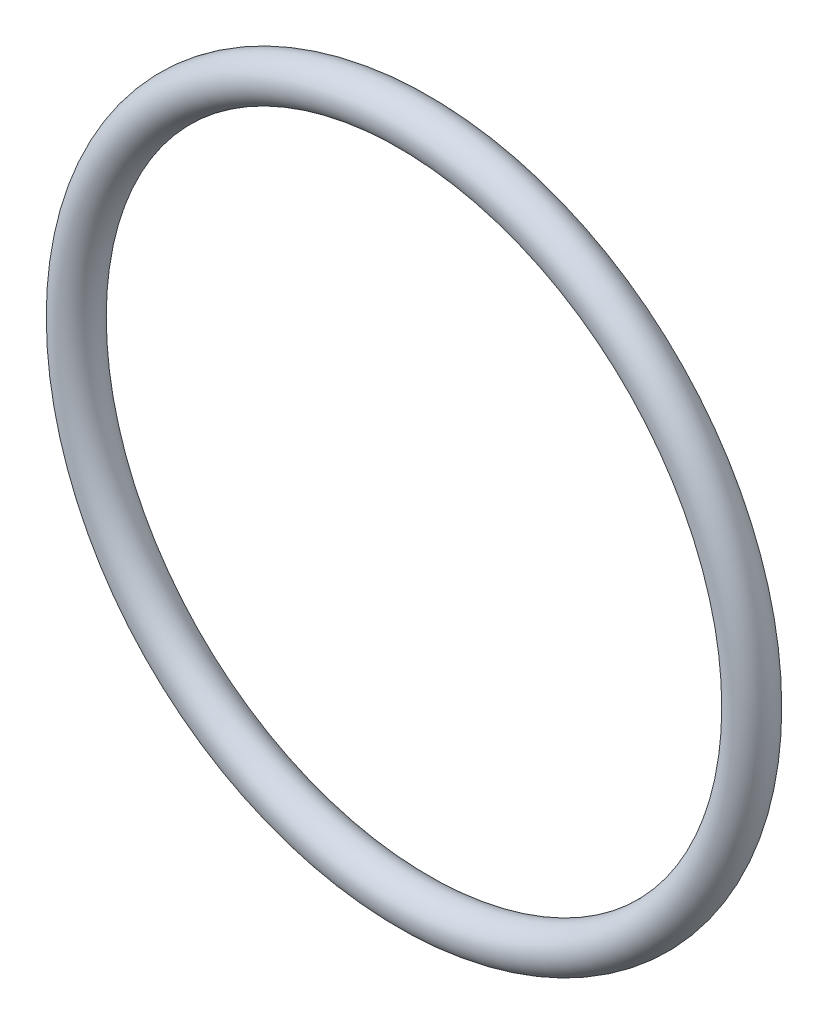
ISO-10303-21;
HEADER;
FILE_DESCRIPTION(('STEP AP214'),'2;1');
FILE_NAME('part.step','',(''),(''),'','','');
FILE_SCHEMA(('AUTOMOTIVE_DESIGN { 1 0 10303 214 1 1 1 1 }'));
ENDSEC;
DATA;
#1=APPLICATION_CONTEXT('core data for automotive mechanical design processes');
#2=APPLICATION_PROTOCOL_DEFINITION('international standard','automotive_design',2000,#1);
#3=PRODUCT_CONTEXT('',#1,'mechanical');
#4=PRODUCT('Part','Part','',(#3));
#5=PRODUCT_RELATED_PRODUCT_CATEGORY('part','',(#4));
#6=PRODUCT_DEFINITION_FORMATION('','',#4);
#7=PRODUCT_DEFINITION_CONTEXT('part definition',#1,'design');
#8=PRODUCT_DEFINITION('design','',#6,#7);
#9=PRODUCT_DEFINITION_SHAPE('','',#8);
#10=(LENGTH_UNIT() NAMED_UNIT(*) SI_UNIT(.MILLI.,.METRE.));
#11=(NAMED_UNIT(*) PLANE_ANGLE_UNIT() SI_UNIT($,.RADIAN.));
#12=(NAMED_UNIT(*) SI_UNIT($,.STERADIAN.) SOLID_ANGLE_UNIT());
#13=UNCERTAINTY_MEASURE_WITH_UNIT(LENGTH_MEASURE(1.E-05),#10,'distance_accuracy_value','');
#14=(GEOMETRIC_REPRESENTATION_CONTEXT(3) GLOBAL_UNCERTAINTY_ASSIGNED_CONTEXT((#13)) GLOBAL_UNIT_ASSIGNED_CONTEXT((#10,
#11,#12)) REPRESENTATION_CONTEXT('',''));
#15=CARTESIAN_POINT('',(0.,0.,0.));
#16=DIRECTION('',(0.,0.,1.));
#17=DIRECTION('',(1.,0.,0.));
#18=AXIS2_PLACEMENT_3D('',#15,#16,#17);
#19=CARTESIAN_POINT('',(14.0282860032337,0.,0.));
#20=DIRECTION('',(0.,0.,1.));
#21=DIRECTION('',(1.,0.,0.));
#22=AXIS2_PLACEMENT_3D('',#19,#20,#21);
#23=TOROIDAL_SURFACE('',#22,31.83098862,2.);
#24=CARTESIAN_POINT('',(-17.8027026167663,0.,0.));
#25=DIRECTION('',(0.,1.,0.));
#26=DIRECTION('',(0.,0.,1.));
#27=AXIS2_PLACEMENT_3D('',#24,#25,#26);
#28=CIRCLE('',#27,2.);
#29=CARTESIAN_POINT('',(-19.8027026167663,0.,0.));
#30=VERTEX_POINT('',#29);
#31=EDGE_CURVE('E10',#30,#30,#28,.T.);
#32=CARTESIAN_POINT('',(14.0282860032337,0.,0.));
#33=DIRECTION('',(0.,0.,1.));
#34=DIRECTION('',(1.,0.,0.));
#35=AXIS2_PLACEMENT_3D('',#32,#33,#34);
#36=CIRCLE('',#35,33.83098862);
#37=EDGE_CURVE('',#30,#30,#36,.T.);
#38=ORIENTED_EDGE('',*,*,#31,.F.);
#39=ORIENTED_EDGE('',*,*,#31,.T.);
#40=ORIENTED_EDGE('',*,*,#37,.T.);
#41=ORIENTED_EDGE('',*,*,#37,.F.);
#42=EDGE_LOOP('',(#38,#40,#39,#41));
#43=FACE_BOUND('',#42,.T.);
#44=ADVANCED_FACE('F30',(#43),#23,.T.);
#45=CLOSED_SHELL('',(#44));
#46=MANIFOLD_SOLID_BREP('B2',#45);
#47=ADVANCED_BREP_SHAPE_REPRESENTATION('',(#18,#46),#14);
#48=SHAPE_DEFINITION_REPRESENTATION(#9,#47);
ENDSEC;
END-ISO-10303-21;
